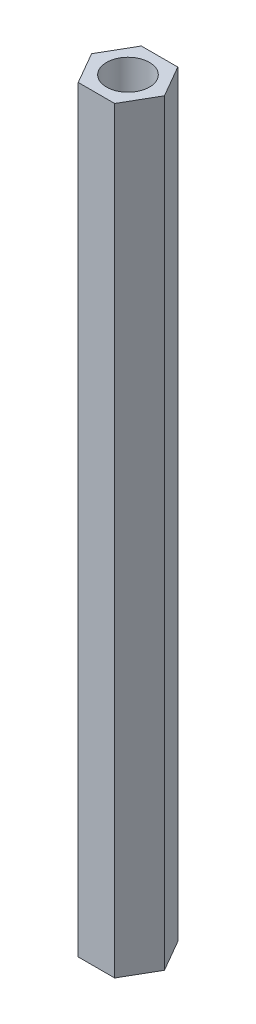
ISO-10303-21;
HEADER;
FILE_DESCRIPTION(('STEP AP214'),'2;1');
FILE_NAME('part.step','',(''),(''),'','','');
FILE_SCHEMA(('AUTOMOTIVE_DESIGN { 1 0 10303 214 1 1 1 1 }'));
ENDSEC;
DATA;
#1=APPLICATION_CONTEXT('core data for automotive mechanical design processes');
#2=APPLICATION_PROTOCOL_DEFINITION('international standard','automotive_design',2000,#1);
#3=PRODUCT_CONTEXT('',#1,'mechanical');
#4=PRODUCT('Part','Part','',(#3));
#5=PRODUCT_RELATED_PRODUCT_CATEGORY('part','',(#4));
#6=PRODUCT_DEFINITION_FORMATION('','',#4);
#7=PRODUCT_DEFINITION_CONTEXT('part definition',#1,'design');
#8=PRODUCT_DEFINITION('design','',#6,#7);
#9=PRODUCT_DEFINITION_SHAPE('','',#8);
#10=(LENGTH_UNIT() NAMED_UNIT(*) SI_UNIT(.MILLI.,.METRE.));
#11=(NAMED_UNIT(*) PLANE_ANGLE_UNIT() SI_UNIT($,.RADIAN.));
#12=(NAMED_UNIT(*) SI_UNIT($,.STERADIAN.) SOLID_ANGLE_UNIT());
#13=UNCERTAINTY_MEASURE_WITH_UNIT(LENGTH_MEASURE(1.E-05),#10,'distance_accuracy_value','');
#14=(GEOMETRIC_REPRESENTATION_CONTEXT(3) GLOBAL_UNCERTAINTY_ASSIGNED_CONTEXT((#13)) GLOBAL_UNIT_ASSIGNED_CONTEXT((#10,
#11,#12)) REPRESENTATION_CONTEXT('',''));
#15=CARTESIAN_POINT('',(0.,0.,0.));
#16=DIRECTION('',(0.,0.,1.));
#17=DIRECTION('',(1.,0.,0.));
#18=AXIS2_PLACEMENT_3D('',#15,#16,#17);
#19=CARTESIAN_POINT('',(0.,60.,0.));
#20=DIRECTION('',(0.,1.,0.));
#21=DIRECTION('',(0.,0.,1.));
#22=AXIS2_PLACEMENT_3D('',#19,#20,#21);
#23=PLANE('',#22);
#24=DIRECTION('',(0.5,0.,-0.866025403784439));
#25=VECTOR('',#24,1.);
#26=CARTESIAN_POINT('',(1.44337567297407,60.,2.5));
#27=LINE('',#26,#25);
#28=CARTESIAN_POINT('',(1.44337567297407,60.,2.5));
#29=VERTEX_POINT('',#28);
#30=CARTESIAN_POINT('',(2.88675134594813,60.,0.));
#31=VERTEX_POINT('',#30);
#32=EDGE_CURVE('E133',#29,#31,#27,.T.);
#33=ORIENTED_EDGE('',*,*,#32,.T.);
#34=DIRECTION('',(-0.5,0.,-0.866025403784438));
#35=VECTOR('',#34,1.);
#36=CARTESIAN_POINT('',(2.88675134594813,60.,0.));
#37=LINE('',#36,#35);
#38=CARTESIAN_POINT('',(1.44337567297406,60.,-2.5));
#39=VERTEX_POINT('',#38);
#40=EDGE_CURVE('E91',#31,#39,#37,.T.);
#41=ORIENTED_EDGE('',*,*,#40,.T.);
#42=DIRECTION('',(-1.,0.,0.));
#43=VECTOR('',#42,1.);
#44=CARTESIAN_POINT('',(1.44337567297406,60.,-2.5));
#45=LINE('',#44,#43);
#46=CARTESIAN_POINT('',(-1.44337567297406,60.,-2.5));
#47=VERTEX_POINT('',#46);
#48=EDGE_CURVE('E104',#39,#47,#45,.T.);
#49=ORIENTED_EDGE('',*,*,#48,.T.);
#50=DIRECTION('',(-0.5,0.,0.866025403784439));
#51=VECTOR('',#50,1.);
#52=CARTESIAN_POINT('',(-1.44337567297406,60.,-2.5));
#53=LINE('',#52,#51);
#54=CARTESIAN_POINT('',(-2.88675134594813,60.,0.));
#55=VERTEX_POINT('',#54);
#56=EDGE_CURVE('E98',#47,#55,#53,.T.);
#57=ORIENTED_EDGE('',*,*,#56,.T.);
#58=DIRECTION('',(0.5,0.,0.866025403784438));
#59=VECTOR('',#58,1.);
#60=CARTESIAN_POINT('',(-2.88675134594813,60.,0.));
#61=LINE('',#60,#59);
#62=CARTESIAN_POINT('',(-1.44337567297406,60.,2.5));
#63=VERTEX_POINT('',#62);
#64=EDGE_CURVE('E102',#55,#63,#61,.T.);
#65=ORIENTED_EDGE('',*,*,#64,.T.);
#66=DIRECTION('',(1.,0.,0.));
#67=VECTOR('',#66,1.);
#68=CARTESIAN_POINT('',(-1.44337567297406,60.,2.5));
#69=LINE('',#68,#67);
#70=EDGE_CURVE('E54',#63,#29,#69,.T.);
#71=ORIENTED_EDGE('',*,*,#70,.T.);
#72=EDGE_LOOP('',(#33,#41,#49,#57,#65,#71));
#73=FACE_BOUND('',#72,.T.);
#74=CARTESIAN_POINT('',(0.,60.,0.));
#75=DIRECTION('',(0.,1.,0.));
#76=DIRECTION('',(0.,0.,1.));
#77=AXIS2_PLACEMENT_3D('',#74,#75,#76);
#78=CIRCLE('',#77,1.7);
#79=CARTESIAN_POINT('',(0.,60.,1.7));
#80=VERTEX_POINT('',#79);
#81=EDGE_CURVE('E126',#80,#80,#78,.T.);
#82=ORIENTED_EDGE('',*,*,#81,.F.);
#83=EDGE_LOOP('',(#82));
#84=FACE_BOUND('',#83,.T.);
#85=ADVANCED_FACE('F37',(#73,#84),#23,.T.);
#86=CARTESIAN_POINT('',(0.,0.,0.));
#87=DIRECTION('',(0.,1.,0.));
#88=DIRECTION('',(0.,0.,1.));
#89=AXIS2_PLACEMENT_3D('',#86,#87,#88);
#90=PLANE('',#89);
#91=DIRECTION('',(0.5,0.,-0.866025403784439));
#92=VECTOR('',#91,1.);
#93=CARTESIAN_POINT('',(1.44337567297407,0.,2.5));
#94=LINE('',#93,#92);
#95=CARTESIAN_POINT('',(1.44337567297407,0.,2.5));
#96=VERTEX_POINT('',#95);
#97=CARTESIAN_POINT('',(2.88675134594813,0.,0.));
#98=VERTEX_POINT('',#97);
#99=EDGE_CURVE('E122',#96,#98,#94,.T.);
#100=ORIENTED_EDGE('',*,*,#99,.F.);
#101=DIRECTION('',(1.,0.,0.));
#102=VECTOR('',#101,1.);
#103=CARTESIAN_POINT('',(-1.44337567297406,0.,2.5));
#104=LINE('',#103,#102);
#105=CARTESIAN_POINT('',(-1.44337567297406,0.,2.5));
#106=VERTEX_POINT('',#105);
#107=EDGE_CURVE('E83',#106,#96,#104,.T.);
#108=ORIENTED_EDGE('',*,*,#107,.F.);
#109=DIRECTION('',(0.5,0.,0.866025403784438));
#110=VECTOR('',#109,1.);
#111=CARTESIAN_POINT('',(-2.88675134594813,0.,0.));
#112=LINE('',#111,#110);
#113=CARTESIAN_POINT('',(-2.88675134594813,0.,0.));
#114=VERTEX_POINT('',#113);
#115=EDGE_CURVE('E77',#114,#106,#112,.T.);
#116=ORIENTED_EDGE('',*,*,#115,.F.);
#117=DIRECTION('',(-0.5,0.,0.866025403784439));
#118=VECTOR('',#117,1.);
#119=CARTESIAN_POINT('',(-1.44337567297406,0.,-2.5));
#120=LINE('',#119,#118);
#121=CARTESIAN_POINT('',(-1.44337567297406,0.,-2.5));
#122=VERTEX_POINT('',#121);
#123=EDGE_CURVE('E112',#122,#114,#120,.T.);
#124=ORIENTED_EDGE('',*,*,#123,.F.);
#125=DIRECTION('',(-1.,0.,0.));
#126=VECTOR('',#125,1.);
#127=CARTESIAN_POINT('',(1.44337567297406,0.,-2.5));
#128=LINE('',#127,#126);
#129=CARTESIAN_POINT('',(1.44337567297406,0.,-2.5));
#130=VERTEX_POINT('',#129);
#131=EDGE_CURVE('E128',#130,#122,#128,.T.);
#132=ORIENTED_EDGE('',*,*,#131,.F.);
#133=DIRECTION('',(-0.5,0.,-0.866025403784438));
#134=VECTOR('',#133,1.);
#135=CARTESIAN_POINT('',(2.88675134594813,0.,0.));
#136=LINE('',#135,#134);
#137=EDGE_CURVE('E125',#98,#130,#136,.T.);
#138=ORIENTED_EDGE('',*,*,#137,.F.);
#139=EDGE_LOOP('',(#100,#108,#116,#124,#132,#138));
#140=FACE_BOUND('',#139,.T.);
#141=CARTESIAN_POINT('',(0.,0.,0.));
#142=DIRECTION('',(0.,1.,0.));
#143=DIRECTION('',(0.,0.,1.));
#144=AXIS2_PLACEMENT_3D('',#141,#142,#143);
#145=CIRCLE('',#144,1.7);
#146=CARTESIAN_POINT('',(0.,0.,1.7));
#147=VERTEX_POINT('',#146);
#148=EDGE_CURVE('E226',#147,#147,#145,.T.);
#149=ORIENTED_EDGE('',*,*,#148,.T.);
#150=EDGE_LOOP('',(#149));
#151=FACE_BOUND('',#150,.T.);
#152=ADVANCED_FACE('F142',(#140,#151),#90,.F.);
#153=CARTESIAN_POINT('',(1.44337567297407,60.,2.5));
#154=DIRECTION('',(-0.866025403784439,0.,-0.5));
#155=DIRECTION('',(-0.5,0.,0.866025403784439));
#156=AXIS2_PLACEMENT_3D('',#153,#154,#155);
#157=PLANE('',#156);
#158=ORIENTED_EDGE('',*,*,#99,.T.);
#159=DIRECTION('',(0.,-1.,0.));
#160=VECTOR('',#159,1.);
#161=CARTESIAN_POINT('',(2.88675134594813,60.,0.));
#162=LINE('',#161,#160);
#163=EDGE_CURVE('E11',#31,#98,#162,.T.);
#164=ORIENTED_EDGE('',*,*,#163,.F.);
#165=ORIENTED_EDGE('',*,*,#32,.F.);
#166=DIRECTION('',(0.,-1.,0.));
#167=VECTOR('',#166,1.);
#168=CARTESIAN_POINT('',(1.44337567297407,60.,2.5));
#169=LINE('',#168,#167);
#170=EDGE_CURVE('E118',#29,#96,#169,.T.);
#171=ORIENTED_EDGE('',*,*,#170,.T.);
#172=EDGE_LOOP('',(#158,#164,#165,#171));
#173=FACE_BOUND('',#172,.T.);
#174=ADVANCED_FACE('F39',(#173),#157,.F.);
#175=CARTESIAN_POINT('',(2.88675134594813,60.,0.));
#176=DIRECTION('',(-0.866025403784438,0.,0.5));
#177=DIRECTION('',(0.5,0.,0.866025403784439));
#178=AXIS2_PLACEMENT_3D('',#175,#176,#177);
#179=PLANE('',#178);
#180=ORIENTED_EDGE('',*,*,#137,.T.);
#181=DIRECTION('',(0.,-1.,0.));
#182=VECTOR('',#181,1.);
#183=CARTESIAN_POINT('',(1.44337567297406,60.,-2.5));
#184=LINE('',#183,#182);
#185=EDGE_CURVE('E46',#39,#130,#184,.T.);
#186=ORIENTED_EDGE('',*,*,#185,.F.);
#187=ORIENTED_EDGE('',*,*,#40,.F.);
#188=ORIENTED_EDGE('',*,*,#163,.T.);
#189=EDGE_LOOP('',(#180,#186,#187,#188));
#190=FACE_BOUND('',#189,.T.);
#191=ADVANCED_FACE('F167',(#190),#179,.F.);
#192=CARTESIAN_POINT('',(1.44337567297406,60.,-2.5));
#193=DIRECTION('',(0.,0.,1.));
#194=DIRECTION('',(1.,0.,0.));
#195=AXIS2_PLACEMENT_3D('',#192,#193,#194);
#196=PLANE('',#195);
#197=ORIENTED_EDGE('',*,*,#131,.T.);
#198=DIRECTION('',(0.,-1.,0.));
#199=VECTOR('',#198,1.);
#200=CARTESIAN_POINT('',(-1.44337567297406,60.,-2.5));
#201=LINE('',#200,#199);
#202=EDGE_CURVE('E113',#47,#122,#201,.T.);
#203=ORIENTED_EDGE('',*,*,#202,.F.);
#204=ORIENTED_EDGE('',*,*,#48,.F.);
#205=ORIENTED_EDGE('',*,*,#185,.T.);
#206=EDGE_LOOP('',(#197,#203,#204,#205));
#207=FACE_BOUND('',#206,.T.);
#208=ADVANCED_FACE('F139',(#207),#196,.F.);
#209=CARTESIAN_POINT('',(-1.44337567297406,60.,-2.5));
#210=DIRECTION('',(0.866025403784439,0.,0.5));
#211=DIRECTION('',(0.5,0.,-0.866025403784439));
#212=AXIS2_PLACEMENT_3D('',#209,#210,#211);
#213=PLANE('',#212);
#214=ORIENTED_EDGE('',*,*,#123,.T.);
#215=DIRECTION('',(0.,-1.,0.));
#216=VECTOR('',#215,1.);
#217=CARTESIAN_POINT('',(-2.88675134594813,60.,0.));
#218=LINE('',#217,#216);
#219=EDGE_CURVE('E109',#55,#114,#218,.T.);
#220=ORIENTED_EDGE('',*,*,#219,.F.);
#221=ORIENTED_EDGE('',*,*,#56,.F.);
#222=ORIENTED_EDGE('',*,*,#202,.T.);
#223=EDGE_LOOP('',(#214,#220,#221,#222));
#224=FACE_BOUND('',#223,.T.);
#225=ADVANCED_FACE('F110',(#224),#213,.F.);
#226=CARTESIAN_POINT('',(-2.88675134594813,60.,0.));
#227=DIRECTION('',(0.866025403784438,0.,-0.5));
#228=DIRECTION('',(-0.5,0.,-0.866025403784439));
#229=AXIS2_PLACEMENT_3D('',#226,#227,#228);
#230=PLANE('',#229);
#231=ORIENTED_EDGE('',*,*,#115,.T.);
#232=DIRECTION('',(0.,-1.,0.));
#233=VECTOR('',#232,1.);
#234=CARTESIAN_POINT('',(-1.44337567297406,60.,2.5));
#235=LINE('',#234,#233);
#236=EDGE_CURVE('E114',#63,#106,#235,.T.);
#237=ORIENTED_EDGE('',*,*,#236,.F.);
#238=ORIENTED_EDGE('',*,*,#64,.F.);
#239=ORIENTED_EDGE('',*,*,#219,.T.);
#240=EDGE_LOOP('',(#231,#237,#238,#239));
#241=FACE_BOUND('',#240,.T.);
#242=ADVANCED_FACE('F116',(#241),#230,.F.);
#243=CARTESIAN_POINT('',(-1.44337567297406,60.,2.5));
#244=DIRECTION('',(0.,0.,-1.));
#245=DIRECTION('',(-1.,0.,0.));
#246=AXIS2_PLACEMENT_3D('',#243,#244,#245);
#247=PLANE('',#246);
#248=ORIENTED_EDGE('',*,*,#107,.T.);
#249=ORIENTED_EDGE('',*,*,#170,.F.);
#250=ORIENTED_EDGE('',*,*,#70,.F.);
#251=ORIENTED_EDGE('',*,*,#236,.T.);
#252=EDGE_LOOP('',(#248,#249,#250,#251));
#253=FACE_BOUND('',#252,.T.);
#254=ADVANCED_FACE('F147',(#253),#247,.F.);
#255=CARTESIAN_POINT('',(0.,60.,0.));
#256=DIRECTION('',(0.,-1.,0.));
#257=DIRECTION('',(0.,0.,-1.));
#258=AXIS2_PLACEMENT_3D('',#255,#256,#257);
#259=CYLINDRICAL_SURFACE('',#258,1.7);
#260=ORIENTED_EDGE('',*,*,#81,.T.);
#261=EDGE_LOOP('',(#260));
#262=FACE_BOUND('',#261,.T.);
#263=ORIENTED_EDGE('',*,*,#148,.F.);
#264=EDGE_LOOP('',(#263));
#265=FACE_BOUND('',#264,.T.);
#266=ADVANCED_FACE('F149',(#262,#265),#259,.F.);
#267=CLOSED_SHELL('',(#85,#152,#174,#191,#208,#225,#242,#254,#266));
#268=MANIFOLD_SOLID_BREP('B2',#267);
#269=ADVANCED_BREP_SHAPE_REPRESENTATION('',(#18,#268),#14);
#270=SHAPE_DEFINITION_REPRESENTATION(#9,#269);
ENDSEC;
END-ISO-10303-21;
